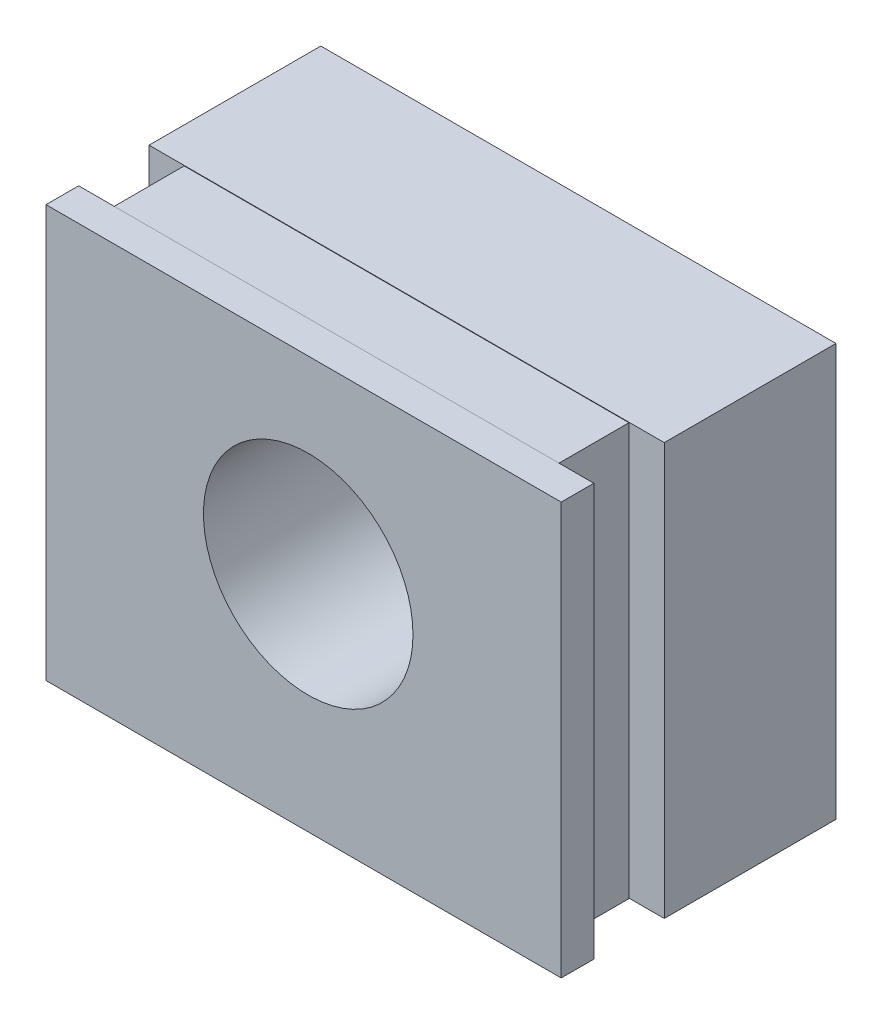
ISO-10303-21;
HEADER;
FILE_DESCRIPTION(('STEP AP214'),'2;1');
FILE_NAME('part.step','',(''),(''),'','','');
FILE_SCHEMA(('AUTOMOTIVE_DESIGN { 1 0 10303 214 1 1 1 1 }'));
ENDSEC;
DATA;
#1=APPLICATION_CONTEXT('core data for automotive mechanical design processes');
#2=APPLICATION_PROTOCOL_DEFINITION('international standard','automotive_design',2000,#1);
#3=PRODUCT_CONTEXT('',#1,'mechanical');
#4=PRODUCT('Part','Part','',(#3));
#5=PRODUCT_RELATED_PRODUCT_CATEGORY('part','',(#4));
#6=PRODUCT_DEFINITION_FORMATION('','',#4);
#7=PRODUCT_DEFINITION_CONTEXT('part definition',#1,'design');
#8=PRODUCT_DEFINITION('design','',#6,#7);
#9=PRODUCT_DEFINITION_SHAPE('','',#8);
#10=(LENGTH_UNIT() NAMED_UNIT(*) SI_UNIT(.MILLI.,.METRE.));
#11=(NAMED_UNIT(*) PLANE_ANGLE_UNIT() SI_UNIT($,.RADIAN.));
#12=(NAMED_UNIT(*) SI_UNIT($,.STERADIAN.) SOLID_ANGLE_UNIT());
#13=UNCERTAINTY_MEASURE_WITH_UNIT(LENGTH_MEASURE(1.E-05),#10,'distance_accuracy_value','');
#14=(GEOMETRIC_REPRESENTATION_CONTEXT(3) GLOBAL_UNCERTAINTY_ASSIGNED_CONTEXT((#13)) GLOBAL_UNIT_ASSIGNED_CONTEXT((#10,
#11,#12)) REPRESENTATION_CONTEXT('',''));
#15=CARTESIAN_POINT('',(0.,0.,0.));
#16=DIRECTION('',(0.,0.,1.));
#17=DIRECTION('',(1.,0.,0.));
#18=AXIS2_PLACEMENT_3D('',#15,#16,#17);
#19=CARTESIAN_POINT('',(0.,0.,7.05));
#20=DIRECTION('',(0.,0.,-1.));
#21=DIRECTION('',(-1.,0.,0.));
#22=AXIS2_PLACEMENT_3D('',#19,#20,#21);
#23=PLANE('',#22);
#24=DIRECTION('',(1.,0.,0.));
#25=VECTOR('',#24,1.);
#26=CARTESIAN_POINT('',(-7.5,-6.,7.05));
#27=LINE('',#26,#25);
#28=CARTESIAN_POINT('',(-6.4775,-6.,7.05));
#29=VERTEX_POINT('',#28);
#30=CARTESIAN_POINT('',(6.4725,-6.,7.05));
#31=VERTEX_POINT('',#30);
#32=EDGE_CURVE('E12',#29,#31,#27,.T.);
#33=ORIENTED_EDGE('',*,*,#32,.F.);
#34=DIRECTION('',(0.,-1.,0.));
#35=VECTOR('',#34,1.);
#36=CARTESIAN_POINT('',(-6.4775,5.98705733735249,7.05));
#37=LINE('',#36,#35);
#38=CARTESIAN_POINT('',(-6.4775,-6.01294266264751,7.05));
#39=VERTEX_POINT('',#38);
#40=EDGE_CURVE('E424',#29,#39,#37,.T.);
#41=ORIENTED_EDGE('',*,*,#40,.T.);
#42=DIRECTION('',(1.,0.,0.));
#43=VECTOR('',#42,1.);
#44=CARTESIAN_POINT('',(-6.4775,-6.01294266264751,7.05));
#45=LINE('',#44,#43);
#46=CARTESIAN_POINT('',(6.4725,-6.01294266264751,7.05));
#47=VERTEX_POINT('',#46);
#48=EDGE_CURVE('E248',#39,#47,#45,.T.);
#49=ORIENTED_EDGE('',*,*,#48,.T.);
#50=DIRECTION('',(0.,-1.,0.));
#51=VECTOR('',#50,1.);
#52=CARTESIAN_POINT('',(6.4725,5.98705733735249,7.05));
#53=LINE('',#52,#51);
#54=EDGE_CURVE('E345',#31,#47,#53,.T.);
#55=ORIENTED_EDGE('',*,*,#54,.F.);
#56=EDGE_LOOP('',(#33,#41,#49,#55));
#57=FACE_BOUND('',#56,.T.);
#58=ADVANCED_FACE('F45',(#57),#23,.F.);
#59=CARTESIAN_POINT('',(-7.5,6.,5.));
#60=DIRECTION('',(1.,0.,0.));
#61=DIRECTION('',(0.,1.,0.));
#62=AXIS2_PLACEMENT_3D('',#59,#60,#61);
#63=PLANE('',#62);
#64=DIRECTION('',(0.,-1.,0.));
#65=VECTOR('',#64,1.);
#66=CARTESIAN_POINT('',(-7.5,6.,0.));
#67=LINE('',#66,#65);
#68=CARTESIAN_POINT('',(-7.5,6.,0.));
#69=VERTEX_POINT('',#68);
#70=CARTESIAN_POINT('',(-7.5,-6.,0.));
#71=VERTEX_POINT('',#70);
#72=EDGE_CURVE('E362',#69,#71,#67,.T.);
#73=ORIENTED_EDGE('',*,*,#72,.T.);
#74=DIRECTION('',(0.,0.,-1.));
#75=VECTOR('',#74,1.);
#76=CARTESIAN_POINT('',(-7.5,-6.,5.));
#77=LINE('',#76,#75);
#78=CARTESIAN_POINT('',(-7.5,-6.,5.));
#79=VERTEX_POINT('',#78);
#80=EDGE_CURVE('E49',#79,#71,#77,.T.);
#81=ORIENTED_EDGE('',*,*,#80,.F.);
#82=DIRECTION('',(0.,-1.,0.));
#83=VECTOR('',#82,1.);
#84=CARTESIAN_POINT('',(-7.5,6.,5.));
#85=LINE('',#84,#83);
#86=CARTESIAN_POINT('',(-7.5,6.,5.));
#87=VERTEX_POINT('',#86);
#88=EDGE_CURVE('E399',#87,#79,#85,.T.);
#89=ORIENTED_EDGE('',*,*,#88,.F.);
#90=DIRECTION('',(0.,0.,-1.));
#91=VECTOR('',#90,1.);
#92=CARTESIAN_POINT('',(-7.5,6.,5.));
#93=LINE('',#92,#91);
#94=EDGE_CURVE('E358',#87,#69,#93,.T.);
#95=ORIENTED_EDGE('',*,*,#94,.T.);
#96=EDGE_LOOP('',(#73,#81,#89,#95));
#97=FACE_BOUND('',#96,.T.);
#98=ADVANCED_FACE('F47',(#97),#63,.F.);
#99=CARTESIAN_POINT('',(-7.5,-6.,5.));
#100=DIRECTION('',(0.,1.,0.));
#101=DIRECTION('',(0.,0.,1.));
#102=AXIS2_PLACEMENT_3D('',#99,#100,#101);
#103=PLANE('',#102);
#104=DIRECTION('',(1.,0.,0.));
#105=VECTOR('',#104,1.);
#106=CARTESIAN_POINT('',(-7.5,-6.,0.));
#107=LINE('',#106,#105);
#108=CARTESIAN_POINT('',(7.5,-6.,0.));
#109=VERTEX_POINT('',#108);
#110=EDGE_CURVE('E366',#71,#109,#107,.T.);
#111=ORIENTED_EDGE('',*,*,#110,.T.);
#112=DIRECTION('',(0.,0.,-1.));
#113=VECTOR('',#112,1.);
#114=CARTESIAN_POINT('',(7.5,-6.,5.));
#115=LINE('',#114,#113);
#116=CARTESIAN_POINT('',(7.5,-6.,5.));
#117=VERTEX_POINT('',#116);
#118=EDGE_CURVE('E382',#117,#109,#115,.T.);
#119=ORIENTED_EDGE('',*,*,#118,.F.);
#120=DIRECTION('',(1.,0.,0.));
#121=VECTOR('',#120,1.);
#122=CARTESIAN_POINT('',(-7.5,-6.,5.));
#123=LINE('',#122,#121);
#124=CARTESIAN_POINT('',(6.4725,-6.,5.));
#125=VERTEX_POINT('',#124);
#126=EDGE_CURVE('E398',#125,#117,#123,.T.);
#127=ORIENTED_EDGE('',*,*,#126,.F.);
#128=CARTESIAN_POINT('',(-6.4775,-5.99999999999999,5.));
#129=VERTEX_POINT('',#128);
#130=EDGE_CURVE('E397',#129,#125,#123,.T.);
#131=ORIENTED_EDGE('',*,*,#130,.F.);
#132=EDGE_CURVE('E393',#79,#129,#123,.T.);
#133=ORIENTED_EDGE('',*,*,#132,.F.);
#134=ORIENTED_EDGE('',*,*,#80,.T.);
#135=EDGE_LOOP('',(#111,#119,#127,#131,#133,#134));
#136=FACE_BOUND('',#135,.T.);
#137=ADVANCED_FACE('F461',(#136),#103,.F.);
#138=CARTESIAN_POINT('',(7.5,6.,5.));
#139=DIRECTION('',(-1.,0.,0.));
#140=DIRECTION('',(0.,0.,1.));
#141=AXIS2_PLACEMENT_3D('',#138,#139,#140);
#142=PLANE('',#141);
#143=DIRECTION('',(0.,1.,0.));
#144=VECTOR('',#143,1.);
#145=CARTESIAN_POINT('',(7.5,6.,0.));
#146=LINE('',#145,#144);
#147=CARTESIAN_POINT('',(7.5,6.,0.));
#148=VERTEX_POINT('',#147);
#149=EDGE_CURVE('E370',#109,#148,#146,.T.);
#150=ORIENTED_EDGE('',*,*,#149,.T.);
#151=DIRECTION('',(0.,0.,-1.));
#152=VECTOR('',#151,1.);
#153=CARTESIAN_POINT('',(7.5,6.,5.));
#154=LINE('',#153,#152);
#155=CARTESIAN_POINT('',(7.5,6.,5.));
#156=VERTEX_POINT('',#155);
#157=EDGE_CURVE('E387',#156,#148,#154,.T.);
#158=ORIENTED_EDGE('',*,*,#157,.F.);
#159=DIRECTION('',(0.,1.,0.));
#160=VECTOR('',#159,1.);
#161=CARTESIAN_POINT('',(7.5,6.,5.));
#162=LINE('',#161,#160);
#163=EDGE_CURVE('E359',#117,#156,#162,.T.);
#164=ORIENTED_EDGE('',*,*,#163,.F.);
#165=ORIENTED_EDGE('',*,*,#118,.T.);
#166=EDGE_LOOP('',(#150,#158,#164,#165));
#167=FACE_BOUND('',#166,.T.);
#168=ADVANCED_FACE('F543',(#167),#142,.F.);
#169=CARTESIAN_POINT('',(-7.5,6.,5.));
#170=DIRECTION('',(0.,-1.,0.));
#171=DIRECTION('',(0.,0.,-1.));
#172=AXIS2_PLACEMENT_3D('',#169,#170,#171);
#173=PLANE('',#172);
#174=DIRECTION('',(-1.,0.,0.));
#175=VECTOR('',#174,1.);
#176=CARTESIAN_POINT('',(-7.5,6.,0.));
#177=LINE('',#176,#175);
#178=EDGE_CURVE('E411',#148,#69,#177,.T.);
#179=ORIENTED_EDGE('',*,*,#178,.T.);
#180=ORIENTED_EDGE('',*,*,#94,.F.);
#181=DIRECTION('',(-1.,0.,0.));
#182=VECTOR('',#181,1.);
#183=CARTESIAN_POINT('',(-7.5,6.,5.));
#184=LINE('',#183,#182);
#185=EDGE_CURVE('E354',#156,#87,#184,.T.);
#186=ORIENTED_EDGE('',*,*,#185,.F.);
#187=ORIENTED_EDGE('',*,*,#157,.T.);
#188=EDGE_LOOP('',(#179,#180,#186,#187));
#189=FACE_BOUND('',#188,.T.);
#190=ADVANCED_FACE('F546',(#189),#173,.F.);
#191=CARTESIAN_POINT('',(0.,0.,5.));
#192=DIRECTION('',(0.,0.,1.));
#193=DIRECTION('',(1.,0.,0.));
#194=AXIS2_PLACEMENT_3D('',#191,#192,#193);
#195=PLANE('',#194);
#196=DIRECTION('',(0.,-1.,0.));
#197=VECTOR('',#196,1.);
#198=CARTESIAN_POINT('',(-6.4775,5.98705733735249,5.));
#199=LINE('',#198,#197);
#200=CARTESIAN_POINT('',(-6.4775,5.98705733735249,5.));
#201=VERTEX_POINT('',#200);
#202=EDGE_CURVE('E309',#201,#129,#199,.T.);
#203=ORIENTED_EDGE('',*,*,#202,.F.);
#204=DIRECTION('',(1.,0.,0.));
#205=VECTOR('',#204,1.);
#206=CARTESIAN_POINT('',(-6.4775,5.98705733735249,5.));
#207=LINE('',#206,#205);
#208=CARTESIAN_POINT('',(6.4725,5.98705733735249,5.));
#209=VERTEX_POINT('',#208);
#210=EDGE_CURVE('E299',#201,#209,#207,.T.);
#211=ORIENTED_EDGE('',*,*,#210,.T.);
#212=DIRECTION('',(0.,-1.,0.));
#213=VECTOR('',#212,1.);
#214=CARTESIAN_POINT('',(6.4725,5.98705733735249,5.));
#215=LINE('',#214,#213);
#216=EDGE_CURVE('E306',#209,#125,#215,.T.);
#217=ORIENTED_EDGE('',*,*,#216,.T.);
#218=ORIENTED_EDGE('',*,*,#126,.T.);
#219=ORIENTED_EDGE('',*,*,#163,.T.);
#220=ORIENTED_EDGE('',*,*,#185,.T.);
#221=ORIENTED_EDGE('',*,*,#88,.T.);
#222=ORIENTED_EDGE('',*,*,#132,.T.);
#223=EDGE_LOOP('',(#203,#211,#217,#218,#219,#220,#221,#222));
#224=FACE_BOUND('',#223,.T.);
#225=ADVANCED_FACE('F456',(#224),#195,.T.);
#226=CARTESIAN_POINT('',(0.,0.,0.));
#227=DIRECTION('',(0.,0.,1.));
#228=DIRECTION('',(1.,0.,0.));
#229=AXIS2_PLACEMENT_3D('',#226,#227,#228);
#230=PLANE('',#229);
#231=CARTESIAN_POINT('',(0.134086482342663,0.5,0.));
#232=DIRECTION('',(0.,0.,1.));
#233=DIRECTION('',(1.,0.,0.));
#234=AXIS2_PLACEMENT_3D('',#231,#232,#233);
#235=CIRCLE('',#234,3.05);
#236=CARTESIAN_POINT('',(3.18408648234266,0.5,0.));
#237=VERTEX_POINT('',#236);
#238=EDGE_CURVE('E491',#237,#237,#235,.T.);
#239=ORIENTED_EDGE('',*,*,#238,.T.);
#240=EDGE_LOOP('',(#239));
#241=FACE_BOUND('',#240,.T.);
#242=ORIENTED_EDGE('',*,*,#72,.F.);
#243=ORIENTED_EDGE('',*,*,#178,.F.);
#244=ORIENTED_EDGE('',*,*,#149,.F.);
#245=ORIENTED_EDGE('',*,*,#110,.F.);
#246=EDGE_LOOP('',(#242,#243,#244,#245));
#247=FACE_BOUND('',#246,.T.);
#248=ADVANCED_FACE('F590',(#241,#247),#230,.F.);
#249=CARTESIAN_POINT('',(-6.4775,-6.01294266264751,7.05));
#250=DIRECTION('',(0.,1.,0.));
#251=DIRECTION('',(-1.,0.,0.));
#252=AXIS2_PLACEMENT_3D('',#249,#250,#251);
#253=PLANE('',#252);
#254=DIRECTION('',(1.,0.,0.));
#255=VECTOR('',#254,1.);
#256=CARTESIAN_POINT('',(-6.4775,-6.01294266264751,5.));
#257=LINE('',#256,#255);
#258=CARTESIAN_POINT('',(-6.4775,-6.01294266264751,5.));
#259=VERTEX_POINT('',#258);
#260=CARTESIAN_POINT('',(6.4725,-6.01294266264751,5.));
#261=VERTEX_POINT('',#260);
#262=EDGE_CURVE('E207',#259,#261,#257,.T.);
#263=ORIENTED_EDGE('',*,*,#262,.T.);
#264=DIRECTION('',(0.,0.,-1.));
#265=VECTOR('',#264,1.);
#266=CARTESIAN_POINT('',(6.4725,-6.01294266264751,7.05));
#267=LINE('',#266,#265);
#268=EDGE_CURVE('E328',#47,#261,#267,.T.);
#269=ORIENTED_EDGE('',*,*,#268,.F.);
#270=ORIENTED_EDGE('',*,*,#48,.F.);
#271=DIRECTION('',(0.,0.,-1.));
#272=VECTOR('',#271,1.);
#273=CARTESIAN_POINT('',(-6.4775,-6.01294266264751,7.05));
#274=LINE('',#273,#272);
#275=EDGE_CURVE('E322',#39,#259,#274,.T.);
#276=ORIENTED_EDGE('',*,*,#275,.T.);
#277=EDGE_LOOP('',(#263,#269,#270,#276));
#278=FACE_BOUND('',#277,.T.);
#279=ADVANCED_FACE('F507',(#278),#253,.F.);
#280=CARTESIAN_POINT('',(6.4725,5.98705733735249,7.05));
#281=DIRECTION('',(1.,0.,0.));
#282=DIRECTION('',(0.,1.,0.));
#283=AXIS2_PLACEMENT_3D('',#280,#281,#282);
#284=PLANE('',#283);
#285=ORIENTED_EDGE('',*,*,#216,.F.);
#286=DIRECTION('',(0.,0.,-1.));
#287=VECTOR('',#286,1.);
#288=CARTESIAN_POINT('',(6.4725,5.98705733735249,7.05));
#289=LINE('',#288,#287);
#290=CARTESIAN_POINT('',(6.4725,5.98705733735249,7.05));
#291=VERTEX_POINT('',#290);
#292=EDGE_CURVE('E321',#291,#209,#289,.T.);
#293=ORIENTED_EDGE('',*,*,#292,.F.);
#294=EDGE_CURVE('E341',#291,#31,#53,.T.);
#295=ORIENTED_EDGE('',*,*,#294,.T.);
#296=ORIENTED_EDGE('',*,*,#54,.T.);
#297=ORIENTED_EDGE('',*,*,#268,.T.);
#298=EDGE_CURVE('E77',#125,#261,#215,.T.);
#299=ORIENTED_EDGE('',*,*,#298,.F.);
#300=EDGE_LOOP('',(#285,#293,#295,#296,#297,#299));
#301=FACE_BOUND('',#300,.T.);
#302=ADVANCED_FACE('F488',(#301),#284,.T.);
#303=CARTESIAN_POINT('',(-6.4775,5.98705733735249,7.05));
#304=DIRECTION('',(0.,1.,0.));
#305=DIRECTION('',(-1.,0.,0.));
#306=AXIS2_PLACEMENT_3D('',#303,#304,#305);
#307=PLANE('',#306);
#308=ORIENTED_EDGE('',*,*,#210,.F.);
#309=DIRECTION('',(0.,0.,-1.));
#310=VECTOR('',#309,1.);
#311=CARTESIAN_POINT('',(-6.4775,5.98705733735249,7.05));
#312=LINE('',#311,#310);
#313=CARTESIAN_POINT('',(-6.4775,5.98705733735249,7.05));
#314=VERTEX_POINT('',#313);
#315=EDGE_CURVE('E317',#314,#201,#312,.T.);
#316=ORIENTED_EDGE('',*,*,#315,.F.);
#317=DIRECTION('',(1.,0.,0.));
#318=VECTOR('',#317,1.);
#319=CARTESIAN_POINT('',(-6.4775,5.98705733735249,7.05));
#320=LINE('',#319,#318);
#321=EDGE_CURVE('E344',#314,#291,#320,.T.);
#322=ORIENTED_EDGE('',*,*,#321,.T.);
#323=ORIENTED_EDGE('',*,*,#292,.T.);
#324=EDGE_LOOP('',(#308,#316,#322,#323));
#325=FACE_BOUND('',#324,.T.);
#326=ADVANCED_FACE('F500',(#325),#307,.T.);
#327=CARTESIAN_POINT('',(-6.4775,5.98705733735249,7.05));
#328=DIRECTION('',(1.,0.,0.));
#329=DIRECTION('',(0.,1.,0.));
#330=AXIS2_PLACEMENT_3D('',#327,#328,#329);
#331=PLANE('',#330);
#332=ORIENTED_EDGE('',*,*,#202,.T.);
#333=EDGE_CURVE('E305',#129,#259,#199,.T.);
#334=ORIENTED_EDGE('',*,*,#333,.T.);
#335=ORIENTED_EDGE('',*,*,#275,.F.);
#336=ORIENTED_EDGE('',*,*,#40,.F.);
#337=EDGE_CURVE('E420',#314,#29,#37,.T.);
#338=ORIENTED_EDGE('',*,*,#337,.F.);
#339=ORIENTED_EDGE('',*,*,#315,.T.);
#340=EDGE_LOOP('',(#332,#334,#335,#336,#338,#339));
#341=FACE_BOUND('',#340,.T.);
#342=ADVANCED_FACE('F475',(#341),#331,.F.);
#343=CARTESIAN_POINT('',(0.,0.,5.));
#344=DIRECTION('',(0.,0.,-1.));
#345=DIRECTION('',(-1.,0.,0.));
#346=AXIS2_PLACEMENT_3D('',#343,#344,#345);
#347=PLANE('',#346);
#348=ORIENTED_EDGE('',*,*,#333,.F.);
#349=ORIENTED_EDGE('',*,*,#130,.T.);
#350=ORIENTED_EDGE('',*,*,#298,.T.);
#351=ORIENTED_EDGE('',*,*,#262,.F.);
#352=EDGE_LOOP('',(#348,#349,#350,#351));
#353=FACE_BOUND('',#352,.T.);
#354=ADVANCED_FACE('F470',(#353),#347,.T.);
#355=CARTESIAN_POINT('',(0.,0.,7.05));
#356=DIRECTION('',(0.,0.,-1.));
#357=DIRECTION('',(-1.,0.,0.));
#358=AXIS2_PLACEMENT_3D('',#355,#356,#357);
#359=PLANE('',#358);
#360=ORIENTED_EDGE('',*,*,#294,.F.);
#361=ORIENTED_EDGE('',*,*,#321,.F.);
#362=ORIENTED_EDGE('',*,*,#337,.T.);
#363=CARTESIAN_POINT('',(-7.5,-6.,7.05));
#364=VERTEX_POINT('',#363);
#365=EDGE_CURVE('E57',#364,#29,#27,.T.);
#366=ORIENTED_EDGE('',*,*,#365,.F.);
#367=DIRECTION('',(0.,-1.,0.));
#368=VECTOR('',#367,1.);
#369=CARTESIAN_POINT('',(-7.5,6.,7.05));
#370=LINE('',#369,#368);
#371=CARTESIAN_POINT('',(-7.5,6.,7.05));
#372=VERTEX_POINT('',#371);
#373=EDGE_CURVE('E196',#372,#364,#370,.T.);
#374=ORIENTED_EDGE('',*,*,#373,.F.);
#375=DIRECTION('',(1.,0.,0.));
#376=VECTOR('',#375,1.);
#377=CARTESIAN_POINT('',(-7.5,6.,7.05));
#378=LINE('',#377,#376);
#379=CARTESIAN_POINT('',(7.5,6.,7.05));
#380=VERTEX_POINT('',#379);
#381=EDGE_CURVE('E274',#372,#380,#378,.T.);
#382=ORIENTED_EDGE('',*,*,#381,.T.);
#383=DIRECTION('',(0.,-1.,0.));
#384=VECTOR('',#383,1.);
#385=CARTESIAN_POINT('',(7.5,6.,7.05));
#386=LINE('',#385,#384);
#387=CARTESIAN_POINT('',(7.5,-6.,7.05));
#388=VERTEX_POINT('',#387);
#389=EDGE_CURVE('E226',#380,#388,#386,.T.);
#390=ORIENTED_EDGE('',*,*,#389,.T.);
#391=EDGE_CURVE('E58',#31,#388,#27,.T.);
#392=ORIENTED_EDGE('',*,*,#391,.F.);
#393=EDGE_LOOP('',(#360,#361,#362,#366,#374,#382,#390,#392));
#394=FACE_BOUND('',#393,.T.);
#395=ADVANCED_FACE('F278',(#394),#359,.T.);
#396=CARTESIAN_POINT('',(-7.5,-6.,8.));
#397=DIRECTION('',(0.,1.,0.));
#398=DIRECTION('',(0.,0.,1.));
#399=AXIS2_PLACEMENT_3D('',#396,#397,#398);
#400=PLANE('',#399);
#401=ORIENTED_EDGE('',*,*,#365,.T.);
#402=ORIENTED_EDGE('',*,*,#32,.T.);
#403=ORIENTED_EDGE('',*,*,#391,.T.);
#404=DIRECTION('',(0.,0.,-1.));
#405=VECTOR('',#404,1.);
#406=CARTESIAN_POINT('',(7.5,-6.,8.));
#407=LINE('',#406,#405);
#408=CARTESIAN_POINT('',(7.5,-6.,8.));
#409=VERTEX_POINT('',#408);
#410=EDGE_CURVE('E199',#409,#388,#407,.T.);
#411=ORIENTED_EDGE('',*,*,#410,.F.);
#412=DIRECTION('',(1.,0.,0.));
#413=VECTOR('',#412,1.);
#414=CARTESIAN_POINT('',(-7.5,-6.,8.));
#415=LINE('',#414,#413);
#416=CARTESIAN_POINT('',(-7.5,-6.,8.));
#417=VERTEX_POINT('',#416);
#418=EDGE_CURVE('E183',#417,#409,#415,.T.);
#419=ORIENTED_EDGE('',*,*,#418,.F.);
#420=DIRECTION('',(0.,0.,-1.));
#421=VECTOR('',#420,1.);
#422=CARTESIAN_POINT('',(-7.5,-6.,8.));
#423=LINE('',#422,#421);
#424=EDGE_CURVE('E222',#417,#364,#423,.T.);
#425=ORIENTED_EDGE('',*,*,#424,.T.);
#426=EDGE_LOOP('',(#401,#402,#403,#411,#419,#425));
#427=FACE_BOUND('',#426,.T.);
#428=ADVANCED_FACE('F201',(#427),#400,.F.);
#429=CARTESIAN_POINT('',(7.5,6.,8.));
#430=DIRECTION('',(1.,0.,0.));
#431=DIRECTION('',(0.,0.,-1.));
#432=AXIS2_PLACEMENT_3D('',#429,#430,#431);
#433=PLANE('',#432);
#434=ORIENTED_EDGE('',*,*,#389,.F.);
#435=DIRECTION('',(0.,0.,-1.));
#436=VECTOR('',#435,1.);
#437=CARTESIAN_POINT('',(7.5,6.,8.));
#438=LINE('',#437,#436);
#439=CARTESIAN_POINT('',(7.5,6.,8.));
#440=VERTEX_POINT('',#439);
#441=EDGE_CURVE('E208',#440,#380,#438,.T.);
#442=ORIENTED_EDGE('',*,*,#441,.F.);
#443=DIRECTION('',(0.,-1.,0.));
#444=VECTOR('',#443,1.);
#445=CARTESIAN_POINT('',(7.5,6.,8.));
#446=LINE('',#445,#444);
#447=EDGE_CURVE('E188',#440,#409,#446,.T.);
#448=ORIENTED_EDGE('',*,*,#447,.T.);
#449=ORIENTED_EDGE('',*,*,#410,.T.);
#450=EDGE_LOOP('',(#434,#442,#448,#449));
#451=FACE_BOUND('',#450,.T.);
#452=ADVANCED_FACE('F210',(#451),#433,.T.);
#453=CARTESIAN_POINT('',(-7.5,6.,8.));
#454=DIRECTION('',(0.,1.,0.));
#455=DIRECTION('',(0.,0.,1.));
#456=AXIS2_PLACEMENT_3D('',#453,#454,#455);
#457=PLANE('',#456);
#458=ORIENTED_EDGE('',*,*,#381,.F.);
#459=DIRECTION('',(0.,0.,-1.));
#460=VECTOR('',#459,1.);
#461=CARTESIAN_POINT('',(-7.5,6.,8.));
#462=LINE('',#461,#460);
#463=CARTESIAN_POINT('',(-7.5,6.,8.));
#464=VERTEX_POINT('',#463);
#465=EDGE_CURVE('E260',#464,#372,#462,.T.);
#466=ORIENTED_EDGE('',*,*,#465,.F.);
#467=DIRECTION('',(1.,0.,0.));
#468=VECTOR('',#467,1.);
#469=CARTESIAN_POINT('',(-7.5,6.,8.));
#470=LINE('',#469,#468);
#471=EDGE_CURVE('E212',#464,#440,#470,.T.);
#472=ORIENTED_EDGE('',*,*,#471,.T.);
#473=ORIENTED_EDGE('',*,*,#441,.T.);
#474=EDGE_LOOP('',(#458,#466,#472,#473));
#475=FACE_BOUND('',#474,.T.);
#476=ADVANCED_FACE('F272',(#475),#457,.T.);
#477=CARTESIAN_POINT('',(-7.5,6.,8.));
#478=DIRECTION('',(1.,0.,0.));
#479=DIRECTION('',(0.,0.,-1.));
#480=AXIS2_PLACEMENT_3D('',#477,#478,#479);
#481=PLANE('',#480);
#482=ORIENTED_EDGE('',*,*,#373,.T.);
#483=ORIENTED_EDGE('',*,*,#424,.F.);
#484=DIRECTION('',(0.,-1.,0.));
#485=VECTOR('',#484,1.);
#486=CARTESIAN_POINT('',(-7.5,6.,8.));
#487=LINE('',#486,#485);
#488=EDGE_CURVE('E191',#464,#417,#487,.T.);
#489=ORIENTED_EDGE('',*,*,#488,.F.);
#490=ORIENTED_EDGE('',*,*,#465,.T.);
#491=EDGE_LOOP('',(#482,#483,#489,#490));
#492=FACE_BOUND('',#491,.T.);
#493=ADVANCED_FACE('F529',(#492),#481,.F.);
#494=CARTESIAN_POINT('',(0.,0.,8.));
#495=DIRECTION('',(0.,0.,-1.));
#496=DIRECTION('',(-1.,0.,0.));
#497=AXIS2_PLACEMENT_3D('',#494,#495,#496);
#498=PLANE('',#497);
#499=CARTESIAN_POINT('',(0.134086482342663,0.5,8.));
#500=DIRECTION('',(0.,0.,1.));
#501=DIRECTION('',(1.,0.,0.));
#502=AXIS2_PLACEMENT_3D('',#499,#500,#501);
#503=CIRCLE('',#502,3.05);
#504=CARTESIAN_POINT('',(3.18408648234266,0.5,8.));
#505=VERTEX_POINT('',#504);
#506=EDGE_CURVE('E867',#505,#505,#503,.T.);
#507=ORIENTED_EDGE('',*,*,#506,.F.);
#508=EDGE_LOOP('',(#507));
#509=FACE_BOUND('',#508,.T.);
#510=ORIENTED_EDGE('',*,*,#418,.T.);
#511=ORIENTED_EDGE('',*,*,#447,.F.);
#512=ORIENTED_EDGE('',*,*,#471,.F.);
#513=ORIENTED_EDGE('',*,*,#488,.T.);
#514=EDGE_LOOP('',(#510,#511,#512,#513));
#515=FACE_BOUND('',#514,.T.);
#516=ADVANCED_FACE('F185',(#509,#515),#498,.F.);
#517=CARTESIAN_POINT('',(0.134086482342663,0.5,0.));
#518=DIRECTION('',(0.,0.,1.));
#519=DIRECTION('',(1.,0.,0.));
#520=AXIS2_PLACEMENT_3D('',#517,#518,#519);
#521=CYLINDRICAL_SURFACE('',#520,3.05);
#522=ORIENTED_EDGE('',*,*,#238,.F.);
#523=EDGE_LOOP('',(#522));
#524=FACE_BOUND('',#523,.T.);
#525=ORIENTED_EDGE('',*,*,#506,.T.);
#526=EDGE_LOOP('',(#525));
#527=FACE_BOUND('',#526,.T.);
#528=ADVANCED_FACE('F575',(#524,#527),#521,.F.);
#529=CLOSED_SHELL('',(#58,#98,#137,#168,#190,#225,#248,#279,#302,#326,#342,#354,#395,#428,#452,
#476,#493,#516,#528));
#530=MANIFOLD_SOLID_BREP('B2',#529);
#531=ADVANCED_BREP_SHAPE_REPRESENTATION('',(#18,#530),#14);
#532=SHAPE_DEFINITION_REPRESENTATION(#9,#531);
ENDSEC;
END-ISO-10303-21;
